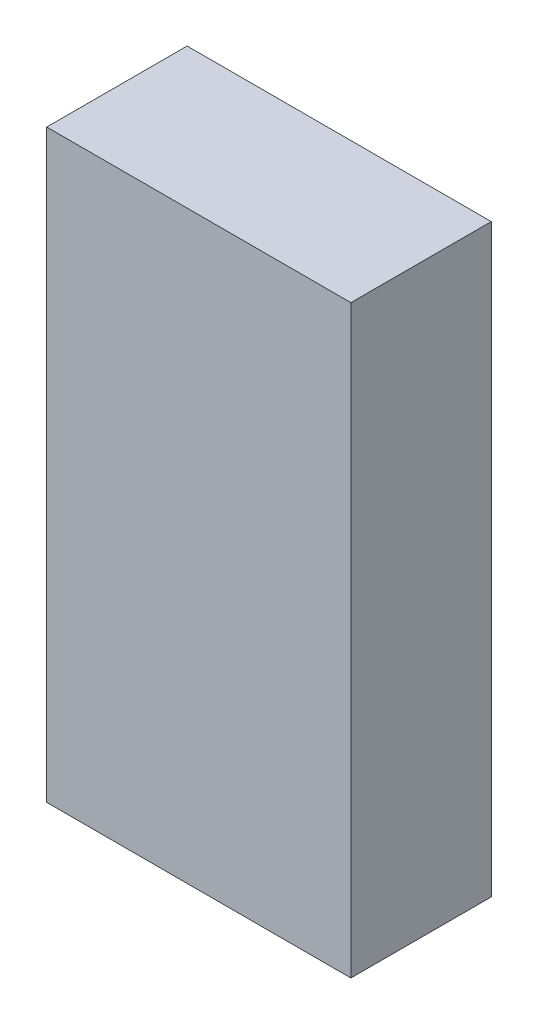
ISO-10303-21;
HEADER;
FILE_DESCRIPTION(('STEP AP214'),'2;1');
FILE_NAME('part.step','',(''),(''),'','','');
FILE_SCHEMA(('AUTOMOTIVE_DESIGN { 1 0 10303 214 1 1 1 1 }'));
ENDSEC;
DATA;
#1=APPLICATION_CONTEXT('core data for automotive mechanical design processes');
#2=APPLICATION_PROTOCOL_DEFINITION('international standard','automotive_design',2000,#1);
#3=PRODUCT_CONTEXT('',#1,'mechanical');
#4=PRODUCT('Part','Part','',(#3));
#5=PRODUCT_RELATED_PRODUCT_CATEGORY('part','',(#4));
#6=PRODUCT_DEFINITION_FORMATION('','',#4);
#7=PRODUCT_DEFINITION_CONTEXT('part definition',#1,'design');
#8=PRODUCT_DEFINITION('design','',#6,#7);
#9=PRODUCT_DEFINITION_SHAPE('','',#8);
#10=(LENGTH_UNIT() NAMED_UNIT(*) SI_UNIT(.MILLI.,.METRE.));
#11=(NAMED_UNIT(*) PLANE_ANGLE_UNIT() SI_UNIT($,.RADIAN.));
#12=(NAMED_UNIT(*) SI_UNIT($,.STERADIAN.) SOLID_ANGLE_UNIT());
#13=UNCERTAINTY_MEASURE_WITH_UNIT(LENGTH_MEASURE(1.E-05),#10,'distance_accuracy_value','');
#14=(GEOMETRIC_REPRESENTATION_CONTEXT(3) GLOBAL_UNCERTAINTY_ASSIGNED_CONTEXT((#13)) GLOBAL_UNIT_ASSIGNED_CONTEXT((#10,
#11,#12)) REPRESENTATION_CONTEXT('',''));
#15=CARTESIAN_POINT('',(0.,0.,0.));
#16=DIRECTION('',(0.,0.,1.));
#17=DIRECTION('',(1.,0.,0.));
#18=AXIS2_PLACEMENT_3D('',#15,#16,#17);
#19=CARTESIAN_POINT('',(0.,0.,12.));
#20=DIRECTION('',(1.,0.,0.));
#21=DIRECTION('',(0.,0.,-1.));
#22=AXIS2_PLACEMENT_3D('',#19,#20,#21);
#23=PLANE('',#22);
#24=DIRECTION('',(0.,-1.,0.));
#25=VECTOR('',#24,1.);
#26=CARTESIAN_POINT('',(0.,0.,0.));
#27=LINE('',#26,#25);
#28=CARTESIAN_POINT('',(0.,50.,0.));
#29=VERTEX_POINT('',#28);
#30=CARTESIAN_POINT('',(0.,0.,0.));
#31=VERTEX_POINT('',#30);
#32=EDGE_CURVE('E96',#29,#31,#27,.T.);
#33=ORIENTED_EDGE('',*,*,#32,.T.);
#34=DIRECTION('',(0.,0.,-1.));
#35=VECTOR('',#34,1.);
#36=CARTESIAN_POINT('',(0.,0.,12.));
#37=LINE('',#36,#35);
#38=CARTESIAN_POINT('',(0.,0.,12.));
#39=VERTEX_POINT('',#38);
#40=EDGE_CURVE('E11',#39,#31,#37,.T.);
#41=ORIENTED_EDGE('',*,*,#40,.F.);
#42=DIRECTION('',(0.,-1.,0.));
#43=VECTOR('',#42,1.);
#44=CARTESIAN_POINT('',(0.,0.,12.));
#45=LINE('',#44,#43);
#46=CARTESIAN_POINT('',(0.,50.,12.));
#47=VERTEX_POINT('',#46);
#48=EDGE_CURVE('E84',#47,#39,#45,.T.);
#49=ORIENTED_EDGE('',*,*,#48,.F.);
#50=DIRECTION('',(0.,0.,-1.));
#51=VECTOR('',#50,1.);
#52=CARTESIAN_POINT('',(0.,50.,12.));
#53=LINE('',#52,#51);
#54=EDGE_CURVE('E92',#47,#29,#53,.T.);
#55=ORIENTED_EDGE('',*,*,#54,.T.);
#56=EDGE_LOOP('',(#33,#41,#49,#55));
#57=FACE_BOUND('',#56,.T.);
#58=ADVANCED_FACE('F33',(#57),#23,.F.);
#59=CARTESIAN_POINT('',(0.,0.,12.));
#60=DIRECTION('',(0.,1.,0.));
#61=DIRECTION('',(0.,0.,1.));
#62=AXIS2_PLACEMENT_3D('',#59,#60,#61);
#63=PLANE('',#62);
#64=DIRECTION('',(1.,0.,0.));
#65=VECTOR('',#64,1.);
#66=CARTESIAN_POINT('',(0.,0.,0.));
#67=LINE('',#66,#65);
#68=CARTESIAN_POINT('',(26.,0.,0.));
#69=VERTEX_POINT('',#68);
#70=EDGE_CURVE('E88',#31,#69,#67,.T.);
#71=ORIENTED_EDGE('',*,*,#70,.T.);
#72=DIRECTION('',(0.,0.,-1.));
#73=VECTOR('',#72,1.);
#74=CARTESIAN_POINT('',(26.,0.,12.));
#75=LINE('',#74,#73);
#76=CARTESIAN_POINT('',(26.,0.,12.));
#77=VERTEX_POINT('',#76);
#78=EDGE_CURVE('E41',#77,#69,#75,.T.);
#79=ORIENTED_EDGE('',*,*,#78,.F.);
#80=DIRECTION('',(1.,0.,0.));
#81=VECTOR('',#80,1.);
#82=CARTESIAN_POINT('',(0.,0.,12.));
#83=LINE('',#82,#81);
#84=EDGE_CURVE('E79',#39,#77,#83,.T.);
#85=ORIENTED_EDGE('',*,*,#84,.F.);
#86=ORIENTED_EDGE('',*,*,#40,.T.);
#87=EDGE_LOOP('',(#71,#79,#85,#86));
#88=FACE_BOUND('',#87,.T.);
#89=ADVANCED_FACE('F87',(#88),#63,.F.);
#90=CARTESIAN_POINT('',(26.,0.,12.));
#91=DIRECTION('',(-1.,0.,0.));
#92=DIRECTION('',(0.,0.,1.));
#93=AXIS2_PLACEMENT_3D('',#90,#91,#92);
#94=PLANE('',#93);
#95=DIRECTION('',(0.,1.,0.));
#96=VECTOR('',#95,1.);
#97=CARTESIAN_POINT('',(26.,0.,0.));
#98=LINE('',#97,#96);
#99=CARTESIAN_POINT('',(26.,50.,0.));
#100=VERTEX_POINT('',#99);
#101=EDGE_CURVE('E66',#69,#100,#98,.T.);
#102=ORIENTED_EDGE('',*,*,#101,.T.);
#103=DIRECTION('',(0.,0.,-1.));
#104=VECTOR('',#103,1.);
#105=CARTESIAN_POINT('',(26.,50.,12.));
#106=LINE('',#105,#104);
#107=CARTESIAN_POINT('',(26.,50.,12.));
#108=VERTEX_POINT('',#107);
#109=EDGE_CURVE('E89',#108,#100,#106,.T.);
#110=ORIENTED_EDGE('',*,*,#109,.F.);
#111=DIRECTION('',(0.,1.,0.));
#112=VECTOR('',#111,1.);
#113=CARTESIAN_POINT('',(26.,0.,12.));
#114=LINE('',#113,#112);
#115=EDGE_CURVE('E82',#77,#108,#114,.T.);
#116=ORIENTED_EDGE('',*,*,#115,.F.);
#117=ORIENTED_EDGE('',*,*,#78,.T.);
#118=EDGE_LOOP('',(#102,#110,#116,#117));
#119=FACE_BOUND('',#118,.T.);
#120=ADVANCED_FACE('F90',(#119),#94,.F.);
#121=CARTESIAN_POINT('',(0.,50.,12.));
#122=DIRECTION('',(0.,-1.,0.));
#123=DIRECTION('',(0.,0.,-1.));
#124=AXIS2_PLACEMENT_3D('',#121,#122,#123);
#125=PLANE('',#124);
#126=DIRECTION('',(-1.,0.,0.));
#127=VECTOR('',#126,1.);
#128=CARTESIAN_POINT('',(0.,50.,0.));
#129=LINE('',#128,#127);
#130=EDGE_CURVE('E72',#100,#29,#129,.T.);
#131=ORIENTED_EDGE('',*,*,#130,.T.);
#132=ORIENTED_EDGE('',*,*,#54,.F.);
#133=DIRECTION('',(-1.,0.,0.));
#134=VECTOR('',#133,1.);
#135=CARTESIAN_POINT('',(0.,50.,12.));
#136=LINE('',#135,#134);
#137=EDGE_CURVE('E49',#108,#47,#136,.T.);
#138=ORIENTED_EDGE('',*,*,#137,.F.);
#139=ORIENTED_EDGE('',*,*,#109,.T.);
#140=EDGE_LOOP('',(#131,#132,#138,#139));
#141=FACE_BOUND('',#140,.T.);
#142=ADVANCED_FACE('F103',(#141),#125,.F.);
#143=CARTESIAN_POINT('',(0.,0.,12.));
#144=DIRECTION('',(0.,0.,-1.));
#145=DIRECTION('',(-1.,0.,0.));
#146=AXIS2_PLACEMENT_3D('',#143,#144,#145);
#147=PLANE('',#146);
#148=ORIENTED_EDGE('',*,*,#48,.T.);
#149=ORIENTED_EDGE('',*,*,#84,.T.);
#150=ORIENTED_EDGE('',*,*,#115,.T.);
#151=ORIENTED_EDGE('',*,*,#137,.T.);
#152=EDGE_LOOP('',(#148,#149,#150,#151));
#153=FACE_BOUND('',#152,.T.);
#154=ADVANCED_FACE('F80',(#153),#147,.F.);
#155=CARTESIAN_POINT('',(0.,0.,0.));
#156=DIRECTION('',(0.,0.,-1.));
#157=DIRECTION('',(-1.,0.,0.));
#158=AXIS2_PLACEMENT_3D('',#155,#156,#157);
#159=PLANE('',#158);
#160=ORIENTED_EDGE('',*,*,#32,.F.);
#161=ORIENTED_EDGE('',*,*,#130,.F.);
#162=ORIENTED_EDGE('',*,*,#101,.F.);
#163=ORIENTED_EDGE('',*,*,#70,.F.);
#164=EDGE_LOOP('',(#160,#161,#162,#163));
#165=FACE_BOUND('',#164,.T.);
#166=ADVANCED_FACE('F106',(#165),#159,.T.);
#167=CLOSED_SHELL('',(#58,#89,#120,#142,#154,#166));
#168=MANIFOLD_SOLID_BREP('B2',#167);
#169=ADVANCED_BREP_SHAPE_REPRESENTATION('',(#18,#168),#14);
#170=SHAPE_DEFINITION_REPRESENTATION(#9,#169);
ENDSEC;
END-ISO-10303-21;
